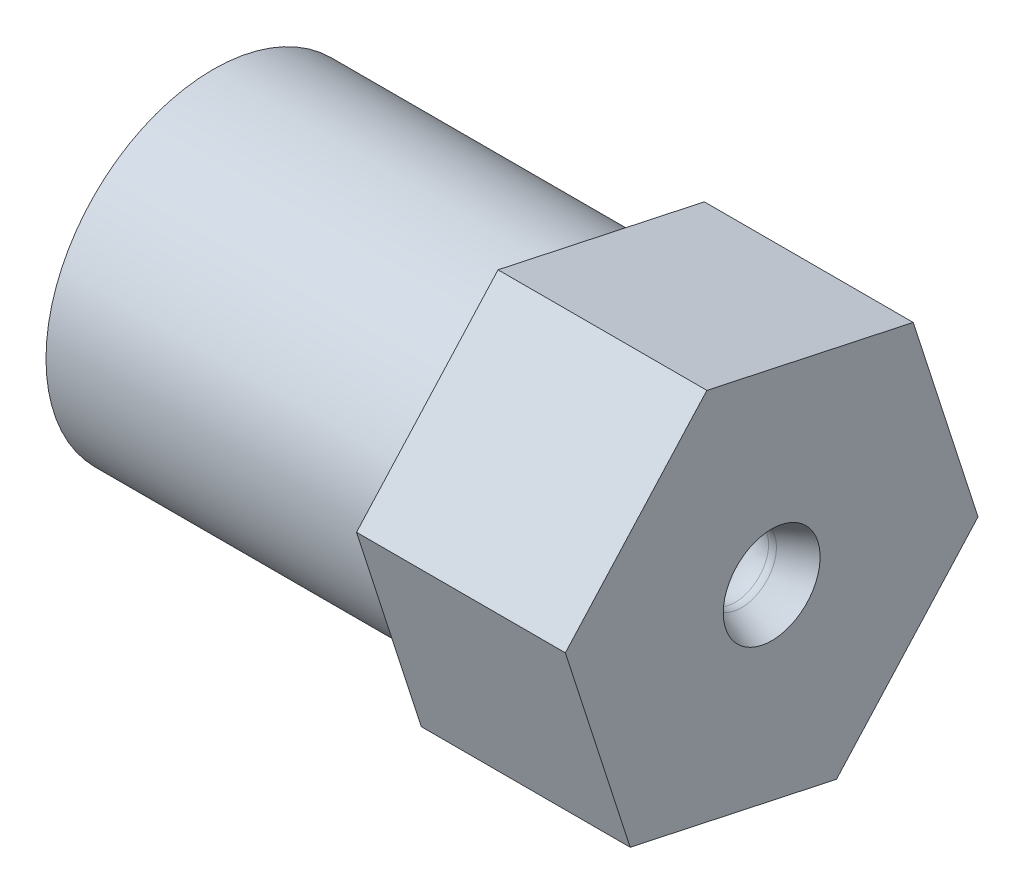
ISO-10303-21;
HEADER;
FILE_DESCRIPTION(('STEP AP214'),'2;1');
FILE_NAME('part.step','',(''),(''),'','','');
FILE_SCHEMA(('AUTOMOTIVE_DESIGN { 1 0 10303 214 1 1 1 1 }'));
ENDSEC;
DATA;
#1=APPLICATION_CONTEXT('core data for automotive mechanical design processes');
#2=APPLICATION_PROTOCOL_DEFINITION('international standard','automotive_design',2000,#1);
#3=PRODUCT_CONTEXT('',#1,'mechanical');
#4=PRODUCT('Part','Part','',(#3));
#5=PRODUCT_RELATED_PRODUCT_CATEGORY('part','',(#4));
#6=PRODUCT_DEFINITION_FORMATION('','',#4);
#7=PRODUCT_DEFINITION_CONTEXT('part definition',#1,'design');
#8=PRODUCT_DEFINITION('design','',#6,#7);
#9=PRODUCT_DEFINITION_SHAPE('','',#8);
#10=(LENGTH_UNIT() NAMED_UNIT(*) SI_UNIT(.MILLI.,.METRE.));
#11=(NAMED_UNIT(*) PLANE_ANGLE_UNIT() SI_UNIT($,.RADIAN.));
#12=(NAMED_UNIT(*) SI_UNIT($,.STERADIAN.) SOLID_ANGLE_UNIT());
#13=UNCERTAINTY_MEASURE_WITH_UNIT(LENGTH_MEASURE(1.E-05),#10,'distance_accuracy_value','');
#14=(GEOMETRIC_REPRESENTATION_CONTEXT(3) GLOBAL_UNCERTAINTY_ASSIGNED_CONTEXT((#13)) GLOBAL_UNIT_ASSIGNED_CONTEXT((#10,
#11,#12)) REPRESENTATION_CONTEXT('',''));
#15=CARTESIAN_POINT('',(0.,0.,0.));
#16=DIRECTION('',(0.,0.,1.));
#17=DIRECTION('',(1.,0.,0.));
#18=AXIS2_PLACEMENT_3D('',#15,#16,#17);
#19=CARTESIAN_POINT('',(0.,0.,0.));
#20=DIRECTION('',(-1.,0.,0.));
#21=DIRECTION('',(0.,0.,1.));
#22=AXIS2_PLACEMENT_3D('',#19,#20,#21);
#23=CYLINDRICAL_SURFACE('',#22,10.16);
#24=CARTESIAN_POINT('',(-11.1155705277848,0.,0.));
#25=DIRECTION('',(1.,0.,0.));
#26=DIRECTION('',(0.,0.,-1.));
#27=AXIS2_PLACEMENT_3D('',#24,#25,#26);
#28=CIRCLE('',#27,10.16);
#29=CARTESIAN_POINT('',(-11.1155705277848,0.,-10.16));
#30=VERTEX_POINT('',#29);
#31=EDGE_CURVE('E11',#30,#30,#28,.F.);
#32=ORIENTED_EDGE('',*,*,#31,.T.);
#33=EDGE_LOOP('',(#32));
#34=FACE_BOUND('',#33,.T.);
#35=CARTESIAN_POINT('',(-31.75,0.,0.));
#36=DIRECTION('',(-1.,0.,0.));
#37=DIRECTION('',(0.,0.,1.));
#38=AXIS2_PLACEMENT_3D('',#35,#36,#37);
#39=CIRCLE('',#38,10.16);
#40=CARTESIAN_POINT('',(-31.75,0.,10.16));
#41=VERTEX_POINT('',#40);
#42=EDGE_CURVE('E227',#41,#41,#39,.T.);
#43=ORIENTED_EDGE('',*,*,#42,.F.);
#44=EDGE_LOOP('',(#43));
#45=FACE_BOUND('',#44,.T.);
#46=ADVANCED_FACE('F39',(#34,#45),#23,.T.);
#47=CARTESIAN_POINT('',(0.,0.,0.));
#48=DIRECTION('',(-1.,0.,0.));
#49=DIRECTION('',(0.,0.,1.));
#50=AXIS2_PLACEMENT_3D('',#47,#48,#49);
#51=TOROIDAL_SURFACE('',#50,5.08,3.048);
#52=CARTESIAN_POINT('',(0.,0.,0.));
#53=DIRECTION('',(-1.,0.,0.));
#54=DIRECTION('',(0.,0.,1.));
#55=AXIS2_PLACEMENT_3D('',#52,#53,#54);
#56=CIRCLE('',#55,2.0319999999983);
#57=CARTESIAN_POINT('',(0.,0.,2.0319999999983));
#58=VERTEX_POINT('',#57);
#59=EDGE_CURVE('E179',#58,#58,#56,.T.);
#60=ORIENTED_EDGE('',*,*,#59,.F.);
#61=EDGE_LOOP('',(#60));
#62=FACE_BOUND('',#61,.T.);
#63=CARTESIAN_POINT('',(-2.15526146905657,0.,0.));
#64=DIRECTION('',(-1.,0.,0.));
#65=DIRECTION('',(0.,0.,1.));
#66=AXIS2_PLACEMENT_3D('',#63,#64,#65);
#67=CIRCLE('',#66,2.92473853094338);
#68=CARTESIAN_POINT('',(-2.15526146905657,0.,2.92473853094338));
#69=VERTEX_POINT('',#68);
#70=EDGE_CURVE('E144',#69,#69,#67,.T.);
#71=ORIENTED_EDGE('',*,*,#70,.T.);
#72=EDGE_LOOP('',(#71));
#73=FACE_BOUND('',#72,.T.);
#74=ADVANCED_FACE('F168',(#62,#73),#51,.T.);
#75=CARTESIAN_POINT('',(0.,0.,0.));
#76=DIRECTION('',(-1.,0.,0.));
#77=DIRECTION('',(0.,0.,1.));
#78=AXIS2_PLACEMENT_3D('',#75,#76,#77);
#79=TOROIDAL_SURFACE('',#78,2.8448,0.8128000000017);
#80=CARTESIAN_POINT('',(0.381586486255969,0.,0.));
#81=DIRECTION('',(-1.,0.,0.));
#82=DIRECTION('',(0.,0.,1.));
#83=AXIS2_PLACEMENT_3D('',#80,#81,#82);
#84=CIRCLE('',#83,2.12714019650662);
#85=CARTESIAN_POINT('',(0.381586486255969,0.,2.12714019650662));
#86=VERTEX_POINT('',#85);
#87=EDGE_CURVE('E233',#86,#86,#84,.T.);
#88=ORIENTED_EDGE('',*,*,#87,.F.);
#89=EDGE_LOOP('',(#88));
#90=FACE_BOUND('',#89,.T.);
#91=ORIENTED_EDGE('',*,*,#59,.T.);
#92=EDGE_LOOP('',(#91));
#93=FACE_BOUND('',#92,.T.);
#94=ADVANCED_FACE('F164',(#90,#93),#79,.T.);
#95=CARTESIAN_POINT('',(464753.814073707,-885454.140098294,0.));
#96=CARTESIAN_POINT('',(-469471.18119256,882949.720002763,0.));
#97=CARTESIAN_POINT('',(474190.074657357,-880436.791346446,0.));
#98=B_SPLINE_CURVE_WITH_KNOTS('',2,(#95,#96,#97),.UNSPECIFIED.,.F.,.F.,(3,3),(0.,1.),.UNSPECIFIED.);
#99=CARTESIAN_POINT('',(0.,0.,0.));
#100=DIRECTION('',(-1.,0.,0.));
#101=AXIS1_PLACEMENT('',#99,#100);
#102=SURFACE_OF_REVOLUTION('',#98,#101);
#103=CARTESIAN_POINT('',(2.21942947221786,0.,0.));
#104=DIRECTION('',(-1.,0.,0.));
#105=DIRECTION('',(0.,0.,1.));
#106=AXIS2_PLACEMENT_3D('',#103,#104,#105);
#107=CIRCLE('',#106,2.94464775482569);
#108=CARTESIAN_POINT('',(2.21942947221786,0.,2.94464775482569));
#109=VERTEX_POINT('',#108);
#110=EDGE_CURVE('E230',#109,#109,#107,.T.);
#111=ORIENTED_EDGE('',*,*,#110,.F.);
#112=EDGE_LOOP('',(#111));
#113=FACE_BOUND('',#112,.T.);
#114=ORIENTED_EDGE('',*,*,#87,.T.);
#115=EDGE_LOOP('',(#114));
#116=FACE_BOUND('',#115,.T.);
#117=ADVANCED_FACE('F159',(#113,#116),#102,.T.);
#118=CARTESIAN_POINT('',(2.21942947221522,10.16,0.));
#119=DIRECTION('',(-1.,0.,0.));
#120=DIRECTION('',(0.,0.,1.));
#121=AXIS2_PLACEMENT_3D('',#118,#119,#120);
#122=PLANE('',#121);
#123=ORIENTED_EDGE('',*,*,#110,.T.);
#124=EDGE_LOOP('',(#123));
#125=FACE_BOUND('',#124,.T.);
#126=DIRECTION('',(0.,-0.951681663898051,-0.307086324345838));
#127=VECTOR('',#126,1.);
#128=CARTESIAN_POINT('',(2.21942947221522,-3.41249677929312,10.5755624900671));
#129=LINE('',#128,#127);
#130=CARTESIAN_POINT('',(2.21942947221522,2.69330707117882,12.5457684242007));
#131=VERTEX_POINT('',#130);
#132=CARTESIAN_POINT('',(2.21942947221522,-9.51830062976507,8.60535655593348));
#133=VERTEX_POINT('',#132);
#134=EDGE_CURVE('E127',#131,#133,#129,.T.);
#135=ORIENTED_EDGE('',*,*,#134,.T.);
#136=DIRECTION('',(0.,-0.209896273910742,-0.977723659424475));
#137=VECTOR('',#136,1.);
#138=CARTESIAN_POINT('',(2.21942947221522,-10.8649541653545,2.33247234383312));
#139=LINE('',#138,#137);
#140=CARTESIAN_POINT('',(2.21942947221522,-12.2116077009439,-3.94041186826723));
#141=VERTEX_POINT('',#140);
#142=EDGE_CURVE('E130',#133,#141,#139,.T.);
#143=ORIENTED_EDGE('',*,*,#142,.T.);
#144=DIRECTION('',(0.,0.741785389987309,-0.670637335078637));
#145=VECTOR('',#144,1.);
#146=CARTESIAN_POINT('',(2.21942947221522,-7.45245738606136,-8.24309014623397));
#147=LINE('',#146,#145);
#148=CARTESIAN_POINT('',(2.21942947221522,-2.69330707117882,-12.5457684242007));
#149=VERTEX_POINT('',#148);
#150=EDGE_CURVE('E133',#141,#149,#147,.T.);
#151=ORIENTED_EDGE('',*,*,#150,.T.);
#152=DIRECTION('',(0.,0.951681663898051,0.307086324345838));
#153=VECTOR('',#152,1.);
#154=CARTESIAN_POINT('',(2.21942947221522,3.41249677929312,-10.5755624900671));
#155=LINE('',#154,#153);
#156=CARTESIAN_POINT('',(2.21942947221522,9.51830062976506,-8.60535655593348));
#157=VERTEX_POINT('',#156);
#158=EDGE_CURVE('E136',#149,#157,#155,.T.);
#159=ORIENTED_EDGE('',*,*,#158,.T.);
#160=DIRECTION('',(0.,0.209896273910742,0.977723659424475));
#161=VECTOR('',#160,1.);
#162=CARTESIAN_POINT('',(2.21942947221522,10.8649541653545,-2.33247234383312));
#163=LINE('',#162,#161);
#164=CARTESIAN_POINT('',(2.21942947221522,12.2116077009439,3.94041186826724));
#165=VERTEX_POINT('',#164);
#166=EDGE_CURVE('E104',#157,#165,#163,.T.);
#167=ORIENTED_EDGE('',*,*,#166,.T.);
#168=DIRECTION('',(0.,-0.741785389987309,0.670637335078637));
#169=VECTOR('',#168,1.);
#170=CARTESIAN_POINT('',(2.21942947221522,7.45245738606136,8.24309014623397));
#171=LINE('',#170,#169);
#172=EDGE_CURVE('E139',#165,#131,#171,.T.);
#173=ORIENTED_EDGE('',*,*,#172,.T.);
#174=EDGE_LOOP('',(#135,#143,#151,#159,#167,#173));
#175=FACE_BOUND('',#174,.T.);
#176=ADVANCED_FACE('F163',(#125,#175),#122,.F.);
#177=CARTESIAN_POINT('',(-31.75,10.16,0.));
#178=DIRECTION('',(1.,0.,0.));
#179=DIRECTION('',(0.,0.,-1.));
#180=AXIS2_PLACEMENT_3D('',#177,#178,#179);
#181=PLANE('',#180);
#182=CARTESIAN_POINT('',(-31.75,0.,0.));
#183=DIRECTION('',(-1.,0.,0.));
#184=DIRECTION('',(0.,0.,1.));
#185=AXIS2_PLACEMENT_3D('',#182,#183,#184);
#186=CIRCLE('',#185,8.6614);
#187=CARTESIAN_POINT('',(-31.75,0.,8.6614));
#188=VERTEX_POINT('',#187);
#189=EDGE_CURVE('E224',#188,#188,#186,.T.);
#190=ORIENTED_EDGE('',*,*,#189,.F.);
#191=EDGE_LOOP('',(#190));
#192=FACE_BOUND('',#191,.T.);
#193=ORIENTED_EDGE('',*,*,#42,.T.);
#194=EDGE_LOOP('',(#193));
#195=FACE_BOUND('',#194,.T.);
#196=ADVANCED_FACE('F251',(#192,#195),#181,.F.);
#197=CARTESIAN_POINT('',(-31.115,0.,0.));
#198=DIRECTION('',(-1.,0.,0.));
#199=DIRECTION('',(0.,0.,1.));
#200=AXIS2_PLACEMENT_3D('',#197,#198,#199);
#201=TOROIDAL_SURFACE('',#200,8.6614,0.635);
#202=CARTESIAN_POINT('',(-31.115,0.,0.));
#203=DIRECTION('',(-1.,0.,0.));
#204=DIRECTION('',(0.,0.,1.));
#205=AXIS2_PLACEMENT_3D('',#202,#203,#204);
#206=CIRCLE('',#205,8.02639999999999);
#207=CARTESIAN_POINT('',(-31.115,0.,8.02639999999999));
#208=VERTEX_POINT('',#207);
#209=EDGE_CURVE('E221',#208,#208,#206,.T.);
#210=ORIENTED_EDGE('',*,*,#209,.F.);
#211=EDGE_LOOP('',(#210));
#212=FACE_BOUND('',#211,.T.);
#213=ORIENTED_EDGE('',*,*,#189,.T.);
#214=EDGE_LOOP('',(#213));
#215=FACE_BOUND('',#214,.T.);
#216=ADVANCED_FACE('F253',(#212,#215),#201,.T.);
#217=CARTESIAN_POINT('',(0.,0.,0.));
#218=DIRECTION('',(-1.,0.,0.));
#219=DIRECTION('',(0.,0.,1.));
#220=AXIS2_PLACEMENT_3D('',#217,#218,#219);
#221=CYLINDRICAL_SURFACE('',#220,8.02639999999999);
#222=CARTESIAN_POINT('',(-25.019,0.,0.));
#223=DIRECTION('',(-1.,0.,0.));
#224=DIRECTION('',(0.,0.,1.));
#225=AXIS2_PLACEMENT_3D('',#222,#223,#224);
#226=CIRCLE('',#225,8.02639999999999);
#227=CARTESIAN_POINT('',(-25.019,0.,8.02639999999999));
#228=VERTEX_POINT('',#227);
#229=EDGE_CURVE('E218',#228,#228,#226,.T.);
#230=ORIENTED_EDGE('',*,*,#229,.F.);
#231=EDGE_LOOP('',(#230));
#232=FACE_BOUND('',#231,.T.);
#233=ORIENTED_EDGE('',*,*,#209,.T.);
#234=EDGE_LOOP('',(#233));
#235=FACE_BOUND('',#234,.T.);
#236=ADVANCED_FACE('F260',(#232,#235),#221,.F.);
#237=CARTESIAN_POINT('',(-25.019,0.,0.));
#238=DIRECTION('',(-1.,0.,0.));
#239=DIRECTION('',(0.,0.,1.));
#240=AXIS2_PLACEMENT_3D('',#237,#238,#239);
#241=TOROIDAL_SURFACE('',#240,7.89939999999999,0.127);
#242=CARTESIAN_POINT('',(-24.892,0.,0.));
#243=DIRECTION('',(-1.,0.,0.));
#244=DIRECTION('',(0.,0.,1.));
#245=AXIS2_PLACEMENT_3D('',#242,#243,#244);
#246=CIRCLE('',#245,7.89939999999999);
#247=CARTESIAN_POINT('',(-24.892,0.,7.89939999999999));
#248=VERTEX_POINT('',#247);
#249=EDGE_CURVE('E215',#248,#248,#246,.T.);
#250=ORIENTED_EDGE('',*,*,#249,.F.);
#251=EDGE_LOOP('',(#250));
#252=FACE_BOUND('',#251,.T.);
#253=ORIENTED_EDGE('',*,*,#229,.T.);
#254=EDGE_LOOP('',(#253));
#255=FACE_BOUND('',#254,.T.);
#256=ADVANCED_FACE('F268',(#252,#255),#241,.F.);
#257=CARTESIAN_POINT('',(-24.892,6.9469,0.));
#258=DIRECTION('',(1.,0.,0.));
#259=DIRECTION('',(0.,0.,-1.));
#260=AXIS2_PLACEMENT_3D('',#257,#258,#259);
#261=PLANE('',#260);
#262=CARTESIAN_POINT('',(-24.892,0.,0.));
#263=DIRECTION('',(-1.,0.,0.));
#264=DIRECTION('',(0.,0.,1.));
#265=AXIS2_PLACEMENT_3D('',#262,#263,#264);
#266=CIRCLE('',#265,6.9469);
#267=CARTESIAN_POINT('',(-24.892,0.,6.9469));
#268=VERTEX_POINT('',#267);
#269=EDGE_CURVE('E212',#268,#268,#266,.T.);
#270=ORIENTED_EDGE('',*,*,#269,.F.);
#271=EDGE_LOOP('',(#270));
#272=FACE_BOUND('',#271,.T.);
#273=ORIENTED_EDGE('',*,*,#249,.T.);
#274=EDGE_LOOP('',(#273));
#275=FACE_BOUND('',#274,.T.);
#276=ADVANCED_FACE('F272',(#272,#275),#261,.F.);
#277=CARTESIAN_POINT('',(0.,0.,0.));
#278=DIRECTION('',(-1.,0.,0.));
#279=DIRECTION('',(0.,0.,1.));
#280=AXIS2_PLACEMENT_3D('',#277,#278,#279);
#281=CYLINDRICAL_SURFACE('',#280,6.9469);
#282=CARTESIAN_POINT('',(-20.066,0.,0.));
#283=DIRECTION('',(-1.,0.,0.));
#284=DIRECTION('',(0.,0.,1.));
#285=AXIS2_PLACEMENT_3D('',#282,#283,#284);
#286=CIRCLE('',#285,6.9469);
#287=CARTESIAN_POINT('',(-20.066,0.,6.9469));
#288=VERTEX_POINT('',#287);
#289=EDGE_CURVE('E209',#288,#288,#286,.T.);
#290=ORIENTED_EDGE('',*,*,#289,.F.);
#291=EDGE_LOOP('',(#290));
#292=FACE_BOUND('',#291,.T.);
#293=ORIENTED_EDGE('',*,*,#269,.T.);
#294=EDGE_LOOP('',(#293));
#295=FACE_BOUND('',#294,.T.);
#296=ADVANCED_FACE('F276',(#292,#295),#281,.F.);
#297=CARTESIAN_POINT('',(-20.066,0.,0.));
#298=DIRECTION('',(-1.,0.,0.));
#299=DIRECTION('',(0.,0.,1.));
#300=AXIS2_PLACEMENT_3D('',#297,#298,#299);
#301=TOROIDAL_SURFACE('',#300,6.8199,0.127);
#302=CARTESIAN_POINT('',(-19.939,0.,0.));
#303=DIRECTION('',(-1.,0.,0.));
#304=DIRECTION('',(0.,0.,1.));
#305=AXIS2_PLACEMENT_3D('',#302,#303,#304);
#306=CIRCLE('',#305,6.8199);
#307=CARTESIAN_POINT('',(-19.939,0.,6.8199));
#308=VERTEX_POINT('',#307);
#309=EDGE_CURVE('E206',#308,#308,#306,.T.);
#310=ORIENTED_EDGE('',*,*,#309,.F.);
#311=EDGE_LOOP('',(#310));
#312=FACE_BOUND('',#311,.T.);
#313=ORIENTED_EDGE('',*,*,#289,.T.);
#314=EDGE_LOOP('',(#313));
#315=FACE_BOUND('',#314,.T.);
#316=ADVANCED_FACE('F280',(#312,#315),#301,.F.);
#317=CARTESIAN_POINT('',(-19.939,5.46100000000001,0.));
#318=DIRECTION('',(1.,0.,0.));
#319=DIRECTION('',(0.,0.,-1.));
#320=AXIS2_PLACEMENT_3D('',#317,#318,#319);
#321=PLANE('',#320);
#322=CARTESIAN_POINT('',(-19.939,0.,0.));
#323=DIRECTION('',(-1.,0.,0.));
#324=DIRECTION('',(0.,0.,1.));
#325=AXIS2_PLACEMENT_3D('',#322,#323,#324);
#326=CIRCLE('',#325,5.46100000000001);
#327=CARTESIAN_POINT('',(-19.939,0.,5.46100000000001));
#328=VERTEX_POINT('',#327);
#329=EDGE_CURVE('E203',#328,#328,#326,.T.);
#330=ORIENTED_EDGE('',*,*,#329,.F.);
#331=EDGE_LOOP('',(#330));
#332=FACE_BOUND('',#331,.T.);
#333=ORIENTED_EDGE('',*,*,#309,.T.);
#334=EDGE_LOOP('',(#333));
#335=FACE_BOUND('',#334,.T.);
#336=ADVANCED_FACE('F284',(#332,#335),#321,.F.);
#337=CARTESIAN_POINT('',(-19.304,0.,0.));
#338=DIRECTION('',(-1.,0.,0.));
#339=DIRECTION('',(0.,0.,1.));
#340=AXIS2_PLACEMENT_3D('',#337,#338,#339);
#341=TOROIDAL_SURFACE('',#340,5.461,0.635);
#342=CARTESIAN_POINT('',(-19.304,0.,0.));
#343=DIRECTION('',(-1.,0.,0.));
#344=DIRECTION('',(0.,0.,1.));
#345=AXIS2_PLACEMENT_3D('',#342,#343,#344);
#346=CIRCLE('',#345,4.826);
#347=CARTESIAN_POINT('',(-19.304,0.,4.826));
#348=VERTEX_POINT('',#347);
#349=EDGE_CURVE('E200',#348,#348,#346,.T.);
#350=ORIENTED_EDGE('',*,*,#349,.F.);
#351=EDGE_LOOP('',(#350));
#352=FACE_BOUND('',#351,.T.);
#353=ORIENTED_EDGE('',*,*,#329,.T.);
#354=EDGE_LOOP('',(#353));
#355=FACE_BOUND('',#354,.T.);
#356=ADVANCED_FACE('F288',(#352,#355),#341,.T.);
#357=CARTESIAN_POINT('',(0.,0.,0.));
#358=DIRECTION('',(-1.,0.,0.));
#359=DIRECTION('',(0.,0.,1.));
#360=AXIS2_PLACEMENT_3D('',#357,#358,#359);
#361=CYLINDRICAL_SURFACE('',#360,4.826);
#362=CARTESIAN_POINT('',(-13.589,0.,0.));
#363=DIRECTION('',(-1.,0.,0.));
#364=DIRECTION('',(0.,0.,1.));
#365=AXIS2_PLACEMENT_3D('',#362,#363,#364);
#366=CIRCLE('',#365,4.826);
#367=CARTESIAN_POINT('',(-13.589,0.,4.826));
#368=VERTEX_POINT('',#367);
#369=EDGE_CURVE('E197',#368,#368,#366,.T.);
#370=ORIENTED_EDGE('',*,*,#369,.F.);
#371=EDGE_LOOP('',(#370));
#372=FACE_BOUND('',#371,.T.);
#373=ORIENTED_EDGE('',*,*,#349,.T.);
#374=EDGE_LOOP('',(#373));
#375=FACE_BOUND('',#374,.T.);
#376=ADVANCED_FACE('F292',(#372,#375),#361,.F.);
#377=CARTESIAN_POINT('',(-13.589,0.,0.));
#378=DIRECTION('',(-1.,0.,0.));
#379=DIRECTION('',(0.,0.,1.));
#380=AXIS2_PLACEMENT_3D('',#377,#378,#379);
#381=TOROIDAL_SURFACE('',#380,4.699,0.127);
#382=CARTESIAN_POINT('',(-13.462,0.,0.));
#383=DIRECTION('',(-1.,0.,0.));
#384=DIRECTION('',(0.,0.,1.));
#385=AXIS2_PLACEMENT_3D('',#382,#383,#384);
#386=CIRCLE('',#385,4.699);
#387=CARTESIAN_POINT('',(-13.462,0.,4.699));
#388=VERTEX_POINT('',#387);
#389=EDGE_CURVE('E194',#388,#388,#386,.T.);
#390=ORIENTED_EDGE('',*,*,#389,.F.);
#391=EDGE_LOOP('',(#390));
#392=FACE_BOUND('',#391,.T.);
#393=ORIENTED_EDGE('',*,*,#369,.T.);
#394=EDGE_LOOP('',(#393));
#395=FACE_BOUND('',#394,.T.);
#396=ADVANCED_FACE('F296',(#392,#395),#381,.F.);
#397=CARTESIAN_POINT('',(-13.462,4.445,0.));
#398=DIRECTION('',(1.,0.,0.));
#399=DIRECTION('',(0.,0.,-1.));
#400=AXIS2_PLACEMENT_3D('',#397,#398,#399);
#401=PLANE('',#400);
#402=CARTESIAN_POINT('',(-13.462,0.,0.));
#403=DIRECTION('',(-1.,0.,0.));
#404=DIRECTION('',(0.,0.,1.));
#405=AXIS2_PLACEMENT_3D('',#402,#403,#404);
#406=CIRCLE('',#405,4.445);
#407=CARTESIAN_POINT('',(-13.462,0.,4.445));
#408=VERTEX_POINT('',#407);
#409=EDGE_CURVE('E189',#408,#408,#406,.T.);
#410=ORIENTED_EDGE('',*,*,#409,.F.);
#411=EDGE_LOOP('',(#410));
#412=FACE_BOUND('',#411,.T.);
#413=ORIENTED_EDGE('',*,*,#389,.T.);
#414=EDGE_LOOP('',(#413));
#415=FACE_BOUND('',#414,.T.);
#416=ADVANCED_FACE('F300',(#412,#415),#401,.F.);
#417=CARTESIAN_POINT('',(0.,0.,0.));
#418=DIRECTION('',(-1.,0.,0.));
#419=DIRECTION('',(0.,0.,1.));
#420=AXIS2_PLACEMENT_3D('',#417,#418,#419);
#421=CYLINDRICAL_SURFACE('',#420,4.445);
#422=CARTESIAN_POINT('',(-4.99065099864778,0.,0.));
#423=DIRECTION('',(-1.,0.,0.));
#424=DIRECTION('',(0.,0.,1.));
#425=AXIS2_PLACEMENT_3D('',#422,#423,#424);
#426=CIRCLE('',#425,4.445);
#427=CARTESIAN_POINT('',(-4.99065099864778,0.,4.445));
#428=VERTEX_POINT('',#427);
#429=EDGE_CURVE('E185',#428,#428,#426,.T.);
#430=ORIENTED_EDGE('',*,*,#429,.F.);
#431=EDGE_LOOP('',(#430));
#432=FACE_BOUND('',#431,.T.);
#433=ORIENTED_EDGE('',*,*,#409,.T.);
#434=EDGE_LOOP('',(#433));
#435=FACE_BOUND('',#434,.T.);
#436=ADVANCED_FACE('F304',(#432,#435),#421,.F.);
#437=CARTESIAN_POINT('',(-4.99065099864778,0.,0.));
#438=DIRECTION('',(-1.,0.,0.));
#439=DIRECTION('',(0.,0.,1.));
#440=AXIS2_PLACEMENT_3D('',#437,#438,#439);
#441=DEGENERATE_TOROIDAL_SURFACE('',#440,1.27,3.175,.T.);
#442=CARTESIAN_POINT('',(-2.74558696838052,0.,0.));
#443=DIRECTION('',(-1.,0.,0.));
#444=DIRECTION('',(0.,0.,1.));
#445=AXIS2_PLACEMENT_3D('',#442,#443,#444);
#446=CIRCLE('',#445,3.51506403026731);
#447=CARTESIAN_POINT('',(-2.74558696838052,0.,3.51506403026731));
#448=VERTEX_POINT('',#447);
#449=EDGE_CURVE('E183',#448,#448,#446,.T.);
#450=ORIENTED_EDGE('',*,*,#449,.F.);
#451=EDGE_LOOP('',(#450));
#452=FACE_BOUND('',#451,.T.);
#453=ORIENTED_EDGE('',*,*,#429,.T.);
#454=EDGE_LOOP('',(#453));
#455=FACE_BOUND('',#454,.T.);
#456=ADVANCED_FACE('F308',(#452,#455),#441,.F.);
#457=CARTESIAN_POINT('',(-2.74558696838052,0.,0.));
#458=DIRECTION('',(-1.,0.,0.));
#459=DIRECTION('',(0.,0.,1.));
#460=AXIS2_PLACEMENT_3D('',#457,#458,#459);
#461=CONICAL_SURFACE('',#460,3.51506403026731,0.785398163397435);
#462=ORIENTED_EDGE('',*,*,#70,.F.);
#463=EDGE_LOOP('',(#462));
#464=FACE_BOUND('',#463,.T.);
#465=ORIENTED_EDGE('',*,*,#449,.T.);
#466=EDGE_LOOP('',(#465));
#467=FACE_BOUND('',#466,.T.);
#468=ADVANCED_FACE('F312',(#464,#467),#461,.F.);
#469=CARTESIAN_POINT('',(-10.4805705277848,-3.41249677929312,10.5755624900671));
#470=DIRECTION('',(0.,-0.307086324345838,0.951681663898051));
#471=DIRECTION('',(0.,-0.951681663898051,-0.307086324345838));
#472=AXIS2_PLACEMENT_3D('',#469,#470,#471);
#473=PLANE('',#472);
#474=ORIENTED_EDGE('',*,*,#134,.F.);
#475=DIRECTION('',(1.,0.,0.));
#476=VECTOR('',#475,1.);
#477=CARTESIAN_POINT('',(-10.4805705277848,2.69330707117882,12.5457684242007));
#478=LINE('',#477,#476);
#479=CARTESIAN_POINT('',(-10.4805705277848,2.69330707117882,12.5457684242007));
#480=VERTEX_POINT('',#479);
#481=EDGE_CURVE('E56',#480,#131,#478,.T.);
#482=ORIENTED_EDGE('',*,*,#481,.F.);
#483=DIRECTION('',(0.,-0.951681663898051,-0.307086324345838));
#484=VECTOR('',#483,1.);
#485=CARTESIAN_POINT('',(-10.4805705277848,-3.41249677929312,10.5755624900671));
#486=LINE('',#485,#484);
#487=CARTESIAN_POINT('',(-10.4805705277848,-9.51830062976507,8.60535655593348));
#488=VERTEX_POINT('',#487);
#489=EDGE_CURVE('E142',#480,#488,#486,.T.);
#490=ORIENTED_EDGE('',*,*,#489,.T.);
#491=DIRECTION('',(1.,0.,0.));
#492=VECTOR('',#491,1.);
#493=CARTESIAN_POINT('',(-10.4805705277848,-9.51830062976507,8.60535655593348));
#494=LINE('',#493,#492);
#495=EDGE_CURVE('E91',#488,#133,#494,.T.);
#496=ORIENTED_EDGE('',*,*,#495,.T.);
#497=EDGE_LOOP('',(#474,#482,#490,#496));
#498=FACE_BOUND('',#497,.T.);
#499=ADVANCED_FACE('F316',(#498),#473,.T.);
#500=CARTESIAN_POINT('',(-10.4805705277848,7.45245738606136,8.24309014623397));
#501=DIRECTION('',(0.,0.670637335078637,0.741785389987309));
#502=DIRECTION('',(0.,-0.741785389987309,0.670637335078637));
#503=AXIS2_PLACEMENT_3D('',#500,#501,#502);
#504=PLANE('',#503);
#505=ORIENTED_EDGE('',*,*,#172,.F.);
#506=DIRECTION('',(1.,0.,0.));
#507=VECTOR('',#506,1.);
#508=CARTESIAN_POINT('',(-10.4805705277848,12.2116077009439,3.94041186826724));
#509=LINE('',#508,#507);
#510=CARTESIAN_POINT('',(-10.4805705277848,12.2116077009439,3.94041186826724));
#511=VERTEX_POINT('',#510);
#512=EDGE_CURVE('E79',#511,#165,#509,.T.);
#513=ORIENTED_EDGE('',*,*,#512,.F.);
#514=DIRECTION('',(0.,-0.741785389987309,0.670637335078637));
#515=VECTOR('',#514,1.);
#516=CARTESIAN_POINT('',(-10.4805705277848,7.45245738606136,8.24309014623397));
#517=LINE('',#516,#515);
#518=EDGE_CURVE('E117',#511,#480,#517,.T.);
#519=ORIENTED_EDGE('',*,*,#518,.T.);
#520=ORIENTED_EDGE('',*,*,#481,.T.);
#521=EDGE_LOOP('',(#505,#513,#519,#520));
#522=FACE_BOUND('',#521,.T.);
#523=ADVANCED_FACE('F319',(#522),#504,.T.);
#524=CARTESIAN_POINT('',(-10.4805705277848,10.8649541653545,-2.33247234383312));
#525=DIRECTION('',(0.,0.977723659424475,-0.209896273910742));
#526=DIRECTION('',(0.,0.209896273910742,0.977723659424475));
#527=AXIS2_PLACEMENT_3D('',#524,#525,#526);
#528=PLANE('',#527);
#529=ORIENTED_EDGE('',*,*,#166,.F.);
#530=DIRECTION('',(1.,0.,0.));
#531=VECTOR('',#530,1.);
#532=CARTESIAN_POINT('',(-10.4805705277848,9.51830062976506,-8.60535655593348));
#533=LINE('',#532,#531);
#534=CARTESIAN_POINT('',(-10.4805705277848,9.51830062976506,-8.60535655593348));
#535=VERTEX_POINT('',#534);
#536=EDGE_CURVE('E99',#535,#157,#533,.T.);
#537=ORIENTED_EDGE('',*,*,#536,.F.);
#538=DIRECTION('',(0.,0.209896273910742,0.977723659424475));
#539=VECTOR('',#538,1.);
#540=CARTESIAN_POINT('',(-10.4805705277848,10.8649541653545,-2.33247234383312));
#541=LINE('',#540,#539);
#542=EDGE_CURVE('E102',#535,#511,#541,.T.);
#543=ORIENTED_EDGE('',*,*,#542,.T.);
#544=ORIENTED_EDGE('',*,*,#512,.T.);
#545=EDGE_LOOP('',(#529,#537,#543,#544));
#546=FACE_BOUND('',#545,.T.);
#547=ADVANCED_FACE('F101',(#546),#528,.T.);
#548=CARTESIAN_POINT('',(-10.4805705277848,3.41249677929312,-10.5755624900671));
#549=DIRECTION('',(0.,0.307086324345838,-0.951681663898051));
#550=DIRECTION('',(0.,0.951681663898051,0.307086324345838));
#551=AXIS2_PLACEMENT_3D('',#548,#549,#550);
#552=PLANE('',#551);
#553=ORIENTED_EDGE('',*,*,#158,.F.);
#554=DIRECTION('',(1.,0.,0.));
#555=VECTOR('',#554,1.);
#556=CARTESIAN_POINT('',(-10.4805705277848,-2.69330707117882,-12.5457684242007));
#557=LINE('',#556,#555);
#558=CARTESIAN_POINT('',(-10.4805705277848,-2.69330707117882,-12.5457684242007));
#559=VERTEX_POINT('',#558);
#560=EDGE_CURVE('E109',#559,#149,#557,.T.);
#561=ORIENTED_EDGE('',*,*,#560,.F.);
#562=DIRECTION('',(0.,0.951681663898051,0.307086324345838));
#563=VECTOR('',#562,1.);
#564=CARTESIAN_POINT('',(-10.4805705277848,3.41249677929312,-10.5755624900671));
#565=LINE('',#564,#563);
#566=EDGE_CURVE('E115',#559,#535,#565,.T.);
#567=ORIENTED_EDGE('',*,*,#566,.T.);
#568=ORIENTED_EDGE('',*,*,#536,.T.);
#569=EDGE_LOOP('',(#553,#561,#567,#568));
#570=FACE_BOUND('',#569,.T.);
#571=ADVANCED_FACE('F119',(#570),#552,.T.);
#572=CARTESIAN_POINT('',(-10.4805705277848,-7.45245738606136,-8.24309014623397));
#573=DIRECTION('',(0.,-0.670637335078637,-0.741785389987309));
#574=DIRECTION('',(0.,0.741785389987309,-0.670637335078637));
#575=AXIS2_PLACEMENT_3D('',#572,#573,#574);
#576=PLANE('',#575);
#577=ORIENTED_EDGE('',*,*,#150,.F.);
#578=DIRECTION('',(1.,0.,0.));
#579=VECTOR('',#578,1.);
#580=CARTESIAN_POINT('',(-10.4805705277848,-12.2116077009439,-3.94041186826723));
#581=LINE('',#580,#579);
#582=CARTESIAN_POINT('',(-10.4805705277848,-12.2116077009439,-3.94041186826723));
#583=VERTEX_POINT('',#582);
#584=EDGE_CURVE('E147',#583,#141,#581,.T.);
#585=ORIENTED_EDGE('',*,*,#584,.F.);
#586=DIRECTION('',(0.,0.741785389987309,-0.670637335078637));
#587=VECTOR('',#586,1.);
#588=CARTESIAN_POINT('',(-10.4805705277848,-7.45245738606136,-8.24309014623397));
#589=LINE('',#588,#587);
#590=EDGE_CURVE('E120',#583,#559,#589,.T.);
#591=ORIENTED_EDGE('',*,*,#590,.T.);
#592=ORIENTED_EDGE('',*,*,#560,.T.);
#593=EDGE_LOOP('',(#577,#585,#591,#592));
#594=FACE_BOUND('',#593,.T.);
#595=ADVANCED_FACE('F322',(#594),#576,.T.);
#596=CARTESIAN_POINT('',(-10.4805705277848,-10.8649541653545,2.33247234383312));
#597=DIRECTION('',(0.,-0.977723659424475,0.209896273910742));
#598=DIRECTION('',(0.,-0.209896273910742,-0.977723659424475));
#599=AXIS2_PLACEMENT_3D('',#596,#597,#598);
#600=PLANE('',#599);
#601=ORIENTED_EDGE('',*,*,#142,.F.);
#602=ORIENTED_EDGE('',*,*,#495,.F.);
#603=DIRECTION('',(0.,-0.209896273910742,-0.977723659424475));
#604=VECTOR('',#603,1.);
#605=CARTESIAN_POINT('',(-10.4805705277848,-10.8649541653545,2.33247234383312));
#606=LINE('',#605,#604);
#607=EDGE_CURVE('E122',#488,#583,#606,.T.);
#608=ORIENTED_EDGE('',*,*,#607,.T.);
#609=ORIENTED_EDGE('',*,*,#584,.T.);
#610=EDGE_LOOP('',(#601,#602,#608,#609));
#611=FACE_BOUND('',#610,.T.);
#612=ADVANCED_FACE('F245',(#611),#600,.T.);
#613=CARTESIAN_POINT('',(-10.4805705277848,0.,0.));
#614=DIRECTION('',(1.,0.,0.));
#615=DIRECTION('',(0.,0.,-1.));
#616=AXIS2_PLACEMENT_3D('',#613,#614,#615);
#617=PLANE('',#616);
#618=CARTESIAN_POINT('',(-10.4805705277848,0.,0.));
#619=DIRECTION('',(1.,0.,0.));
#620=DIRECTION('',(0.,0.,-1.));
#621=AXIS2_PLACEMENT_3D('',#618,#619,#620);
#622=CIRCLE('',#621,10.795);
#623=CARTESIAN_POINT('',(-10.4805705277848,0.,-10.795));
#624=VERTEX_POINT('',#623);
#625=EDGE_CURVE('E48',#624,#624,#622,.T.);
#626=ORIENTED_EDGE('',*,*,#625,.T.);
#627=EDGE_LOOP('',(#626));
#628=FACE_BOUND('',#627,.T.);
#629=ORIENTED_EDGE('',*,*,#489,.F.);
#630=ORIENTED_EDGE('',*,*,#518,.F.);
#631=ORIENTED_EDGE('',*,*,#542,.F.);
#632=ORIENTED_EDGE('',*,*,#566,.F.);
#633=ORIENTED_EDGE('',*,*,#590,.F.);
#634=ORIENTED_EDGE('',*,*,#607,.F.);
#635=EDGE_LOOP('',(#629,#630,#631,#632,#633,#634));
#636=FACE_BOUND('',#635,.T.);
#637=ADVANCED_FACE('F113',(#628,#636),#617,.F.);
#638=CARTESIAN_POINT('',(-11.1155705277848,0.,0.));
#639=DIRECTION('',(1.,0.,0.));
#640=DIRECTION('',(0.,0.,-1.));
#641=AXIS2_PLACEMENT_3D('',#638,#639,#640);
#642=TOROIDAL_SURFACE('',#641,10.795,0.635);
#643=ORIENTED_EDGE('',*,*,#31,.F.);
#644=EDGE_LOOP('',(#643));
#645=FACE_BOUND('',#644,.T.);
#646=ORIENTED_EDGE('',*,*,#625,.F.);
#647=EDGE_LOOP('',(#646));
#648=FACE_BOUND('',#647,.T.);
#649=ADVANCED_FACE('F41',(#645,#648),#642,.F.);
#650=CLOSED_SHELL('',(#46,#74,#94,#117,#176,#196,#216,#236,#256,#276,#296,#316,#336,#356,#376,
#396,#416,#436,#456,#468,#499,#523,#547,#571,#595,#612,#637,#649));
#651=MANIFOLD_SOLID_BREP('B2',#650);
#652=ADVANCED_BREP_SHAPE_REPRESENTATION('',(#18,#651),#14);
#653=SHAPE_DEFINITION_REPRESENTATION(#9,#652);
ENDSEC;
END-ISO-10303-21;
